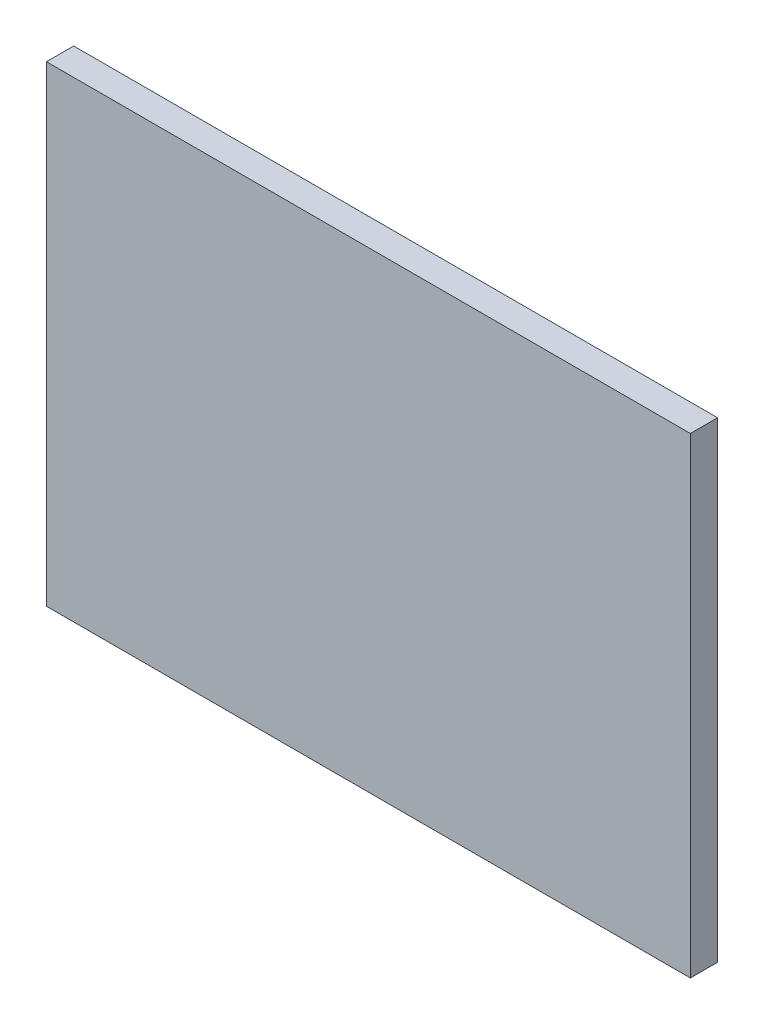
ISO-10303-21;
HEADER;
FILE_DESCRIPTION(('STEP AP214'),'2;1');
FILE_NAME('part.step','',(''),(''),'','','');
FILE_SCHEMA(('AUTOMOTIVE_DESIGN { 1 0 10303 214 1 1 1 1 }'));
ENDSEC;
DATA;
#1=APPLICATION_CONTEXT('core data for automotive mechanical design processes');
#2=APPLICATION_PROTOCOL_DEFINITION('international standard','automotive_design',2000,#1);
#3=PRODUCT_CONTEXT('',#1,'mechanical');
#4=PRODUCT('Part','Part','',(#3));
#5=PRODUCT_RELATED_PRODUCT_CATEGORY('part','',(#4));
#6=PRODUCT_DEFINITION_FORMATION('','',#4);
#7=PRODUCT_DEFINITION_CONTEXT('part definition',#1,'design');
#8=PRODUCT_DEFINITION('design','',#6,#7);
#9=PRODUCT_DEFINITION_SHAPE('','',#8);
#10=(LENGTH_UNIT() NAMED_UNIT(*) SI_UNIT(.MILLI.,.METRE.));
#11=(NAMED_UNIT(*) PLANE_ANGLE_UNIT() SI_UNIT($,.RADIAN.));
#12=(NAMED_UNIT(*) SI_UNIT($,.STERADIAN.) SOLID_ANGLE_UNIT());
#13=UNCERTAINTY_MEASURE_WITH_UNIT(LENGTH_MEASURE(1.E-05),#10,'distance_accuracy_value','');
#14=(GEOMETRIC_REPRESENTATION_CONTEXT(3) GLOBAL_UNCERTAINTY_ASSIGNED_CONTEXT((#13)) GLOBAL_UNIT_ASSIGNED_CONTEXT((#10,
#11,#12)) REPRESENTATION_CONTEXT('',''));
#15=CARTESIAN_POINT('',(0.,0.,0.));
#16=DIRECTION('',(0.,0.,1.));
#17=DIRECTION('',(1.,0.,0.));
#18=AXIS2_PLACEMENT_3D('',#15,#16,#17);
#19=CARTESIAN_POINT('',(35.5,-26.,3.));
#20=DIRECTION('',(-1.,0.,0.));
#21=DIRECTION('',(0.,0.,1.));
#22=AXIS2_PLACEMENT_3D('',#19,#20,#21);
#23=PLANE('',#22);
#24=DIRECTION('',(0.,1.,0.));
#25=VECTOR('',#24,1.);
#26=CARTESIAN_POINT('',(35.5,-26.,0.));
#27=LINE('',#26,#25);
#28=CARTESIAN_POINT('',(35.5,-26.,0.));
#29=VERTEX_POINT('',#28);
#30=CARTESIAN_POINT('',(35.5,26.,0.));
#31=VERTEX_POINT('',#30);
#32=EDGE_CURVE('E100',#29,#31,#27,.T.);
#33=ORIENTED_EDGE('',*,*,#32,.T.);
#34=DIRECTION('',(0.,0.,-1.));
#35=VECTOR('',#34,1.);
#36=CARTESIAN_POINT('',(35.5,26.,3.));
#37=LINE('',#36,#35);
#38=CARTESIAN_POINT('',(35.5,26.,3.));
#39=VERTEX_POINT('',#38);
#40=EDGE_CURVE('E11',#39,#31,#37,.T.);
#41=ORIENTED_EDGE('',*,*,#40,.F.);
#42=DIRECTION('',(0.,1.,0.));
#43=VECTOR('',#42,1.);
#44=CARTESIAN_POINT('',(35.5,-26.,3.));
#45=LINE('',#44,#43);
#46=CARTESIAN_POINT('',(35.5,-26.,3.));
#47=VERTEX_POINT('',#46);
#48=EDGE_CURVE('E88',#47,#39,#45,.T.);
#49=ORIENTED_EDGE('',*,*,#48,.F.);
#50=DIRECTION('',(0.,0.,-1.));
#51=VECTOR('',#50,1.);
#52=CARTESIAN_POINT('',(35.5,-26.,3.));
#53=LINE('',#52,#51);
#54=EDGE_CURVE('E96',#47,#29,#53,.T.);
#55=ORIENTED_EDGE('',*,*,#54,.T.);
#56=EDGE_LOOP('',(#33,#41,#49,#55));
#57=FACE_BOUND('',#56,.T.);
#58=ADVANCED_FACE('F37',(#57),#23,.F.);
#59=CARTESIAN_POINT('',(-35.5,26.,3.));
#60=DIRECTION('',(0.,-1.,0.));
#61=DIRECTION('',(0.,0.,-1.));
#62=AXIS2_PLACEMENT_3D('',#59,#60,#61);
#63=PLANE('',#62);
#64=DIRECTION('',(-1.,0.,0.));
#65=VECTOR('',#64,1.);
#66=CARTESIAN_POINT('',(-35.5,26.,0.));
#67=LINE('',#66,#65);
#68=CARTESIAN_POINT('',(-35.5,26.,0.));
#69=VERTEX_POINT('',#68);
#70=EDGE_CURVE('E92',#31,#69,#67,.T.);
#71=ORIENTED_EDGE('',*,*,#70,.T.);
#72=DIRECTION('',(0.,0.,-1.));
#73=VECTOR('',#72,1.);
#74=CARTESIAN_POINT('',(-35.5,26.,3.));
#75=LINE('',#74,#73);
#76=CARTESIAN_POINT('',(-35.5,26.,3.));
#77=VERTEX_POINT('',#76);
#78=EDGE_CURVE('E45',#77,#69,#75,.T.);
#79=ORIENTED_EDGE('',*,*,#78,.F.);
#80=DIRECTION('',(-1.,0.,0.));
#81=VECTOR('',#80,1.);
#82=CARTESIAN_POINT('',(-35.5,26.,3.));
#83=LINE('',#82,#81);
#84=EDGE_CURVE('E83',#39,#77,#83,.T.);
#85=ORIENTED_EDGE('',*,*,#84,.F.);
#86=ORIENTED_EDGE('',*,*,#40,.T.);
#87=EDGE_LOOP('',(#71,#79,#85,#86));
#88=FACE_BOUND('',#87,.T.);
#89=ADVANCED_FACE('F91',(#88),#63,.F.);
#90=CARTESIAN_POINT('',(-35.5,-26.,3.));
#91=DIRECTION('',(1.,0.,0.));
#92=DIRECTION('',(0.,0.,-1.));
#93=AXIS2_PLACEMENT_3D('',#90,#91,#92);
#94=PLANE('',#93);
#95=DIRECTION('',(0.,-1.,0.));
#96=VECTOR('',#95,1.);
#97=CARTESIAN_POINT('',(-35.5,-26.,0.));
#98=LINE('',#97,#96);
#99=CARTESIAN_POINT('',(-35.5,-26.,0.));
#100=VERTEX_POINT('',#99);
#101=EDGE_CURVE('E70',#69,#100,#98,.T.);
#102=ORIENTED_EDGE('',*,*,#101,.T.);
#103=DIRECTION('',(0.,0.,-1.));
#104=VECTOR('',#103,1.);
#105=CARTESIAN_POINT('',(-35.5,-26.,3.));
#106=LINE('',#105,#104);
#107=CARTESIAN_POINT('',(-35.5,-26.,3.));
#108=VERTEX_POINT('',#107);
#109=EDGE_CURVE('E93',#108,#100,#106,.T.);
#110=ORIENTED_EDGE('',*,*,#109,.F.);
#111=DIRECTION('',(0.,-1.,0.));
#112=VECTOR('',#111,1.);
#113=CARTESIAN_POINT('',(-35.5,-26.,3.));
#114=LINE('',#113,#112);
#115=EDGE_CURVE('E86',#77,#108,#114,.T.);
#116=ORIENTED_EDGE('',*,*,#115,.F.);
#117=ORIENTED_EDGE('',*,*,#78,.T.);
#118=EDGE_LOOP('',(#102,#110,#116,#117));
#119=FACE_BOUND('',#118,.T.);
#120=ADVANCED_FACE('F94',(#119),#94,.F.);
#121=CARTESIAN_POINT('',(-35.5,-26.,3.));
#122=DIRECTION('',(0.,1.,0.));
#123=DIRECTION('',(0.,0.,1.));
#124=AXIS2_PLACEMENT_3D('',#121,#122,#123);
#125=PLANE('',#124);
#126=DIRECTION('',(1.,0.,0.));
#127=VECTOR('',#126,1.);
#128=CARTESIAN_POINT('',(-35.5,-26.,0.));
#129=LINE('',#128,#127);
#130=EDGE_CURVE('E76',#100,#29,#129,.T.);
#131=ORIENTED_EDGE('',*,*,#130,.T.);
#132=ORIENTED_EDGE('',*,*,#54,.F.);
#133=DIRECTION('',(1.,0.,0.));
#134=VECTOR('',#133,1.);
#135=CARTESIAN_POINT('',(-35.5,-26.,3.));
#136=LINE('',#135,#134);
#137=EDGE_CURVE('E53',#108,#47,#136,.T.);
#138=ORIENTED_EDGE('',*,*,#137,.F.);
#139=ORIENTED_EDGE('',*,*,#109,.T.);
#140=EDGE_LOOP('',(#131,#132,#138,#139));
#141=FACE_BOUND('',#140,.T.);
#142=ADVANCED_FACE('F107',(#141),#125,.F.);
#143=CARTESIAN_POINT('',(0.,0.,3.));
#144=DIRECTION('',(0.,0.,-1.));
#145=DIRECTION('',(-1.,0.,0.));
#146=AXIS2_PLACEMENT_3D('',#143,#144,#145);
#147=PLANE('',#146);
#148=ORIENTED_EDGE('',*,*,#48,.T.);
#149=ORIENTED_EDGE('',*,*,#84,.T.);
#150=ORIENTED_EDGE('',*,*,#115,.T.);
#151=ORIENTED_EDGE('',*,*,#137,.T.);
#152=EDGE_LOOP('',(#148,#149,#150,#151));
#153=FACE_BOUND('',#152,.T.);
#154=ADVANCED_FACE('F84',(#153),#147,.F.);
#155=CARTESIAN_POINT('',(0.,0.,0.));
#156=DIRECTION('',(0.,0.,-1.));
#157=DIRECTION('',(-1.,0.,0.));
#158=AXIS2_PLACEMENT_3D('',#155,#156,#157);
#159=PLANE('',#158);
#160=ORIENTED_EDGE('',*,*,#32,.F.);
#161=ORIENTED_EDGE('',*,*,#130,.F.);
#162=ORIENTED_EDGE('',*,*,#101,.F.);
#163=ORIENTED_EDGE('',*,*,#70,.F.);
#164=EDGE_LOOP('',(#160,#161,#162,#163));
#165=FACE_BOUND('',#164,.T.);
#166=ADVANCED_FACE('F110',(#165),#159,.T.);
#167=CLOSED_SHELL('',(#58,#89,#120,#142,#154,#166));
#168=MANIFOLD_SOLID_BREP('B2',#167);
#169=ADVANCED_BREP_SHAPE_REPRESENTATION('',(#18,#168),#14);
#170=SHAPE_DEFINITION_REPRESENTATION(#9,#169);
ENDSEC;
END-ISO-10303-21;
